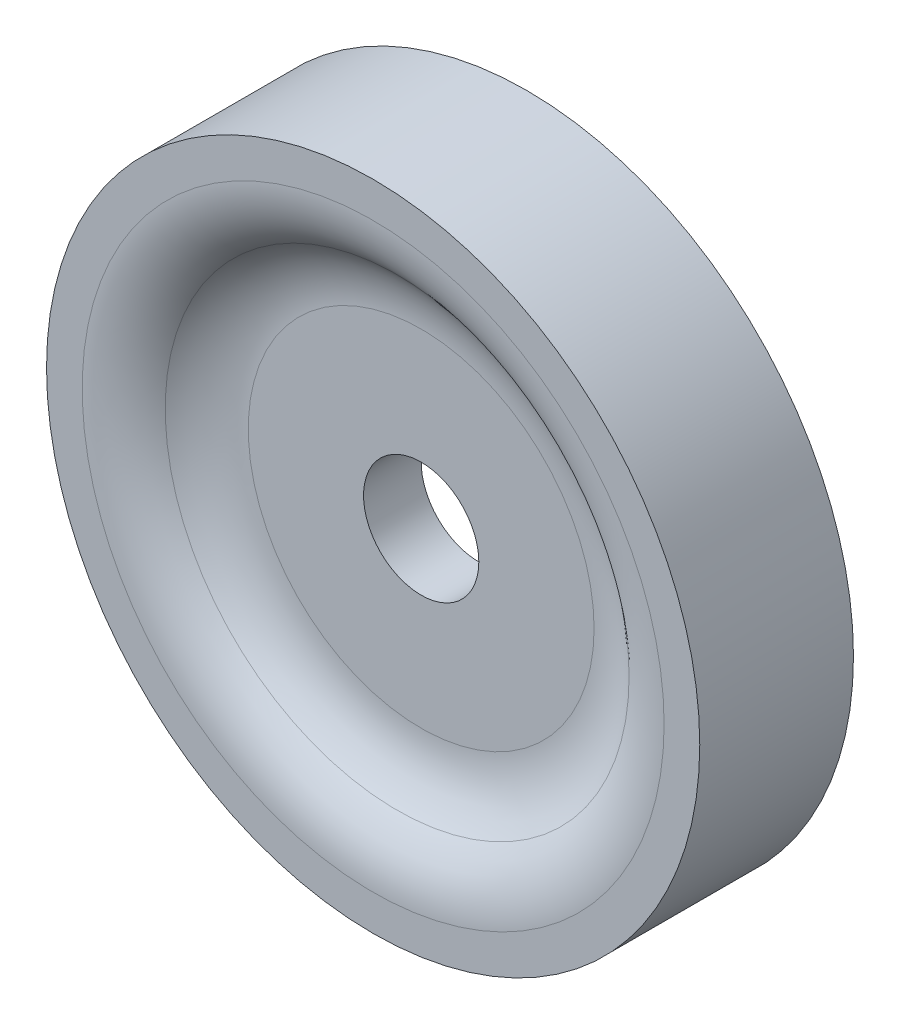
ISO-10303-21;
HEADER;
FILE_DESCRIPTION(('STEP AP214'),'2;1');
FILE_NAME('part.step','',(''),(''),'','','');
FILE_SCHEMA(('AUTOMOTIVE_DESIGN { 1 0 10303 214 1 1 1 1 }'));
ENDSEC;
DATA;
#1=APPLICATION_CONTEXT('core data for automotive mechanical design processes');
#2=APPLICATION_PROTOCOL_DEFINITION('international standard','automotive_design',2000,#1);
#3=PRODUCT_CONTEXT('',#1,'mechanical');
#4=PRODUCT('Part','Part','',(#3));
#5=PRODUCT_RELATED_PRODUCT_CATEGORY('part','',(#4));
#6=PRODUCT_DEFINITION_FORMATION('','',#4);
#7=PRODUCT_DEFINITION_CONTEXT('part definition',#1,'design');
#8=PRODUCT_DEFINITION('design','',#6,#7);
#9=PRODUCT_DEFINITION_SHAPE('','',#8);
#10=(LENGTH_UNIT() NAMED_UNIT(*) SI_UNIT(.MILLI.,.METRE.));
#11=(NAMED_UNIT(*) PLANE_ANGLE_UNIT() SI_UNIT($,.RADIAN.));
#12=(NAMED_UNIT(*) SI_UNIT($,.STERADIAN.) SOLID_ANGLE_UNIT());
#13=UNCERTAINTY_MEASURE_WITH_UNIT(LENGTH_MEASURE(1.E-05),#10,'distance_accuracy_value','');
#14=(GEOMETRIC_REPRESENTATION_CONTEXT(3) GLOBAL_UNCERTAINTY_ASSIGNED_CONTEXT((#13)) GLOBAL_UNIT_ASSIGNED_CONTEXT((#10,
#11,#12)) REPRESENTATION_CONTEXT('',''));
#15=CARTESIAN_POINT('',(0.,0.,0.));
#16=DIRECTION('',(0.,0.,1.));
#17=DIRECTION('',(1.,0.,0.));
#18=AXIS2_PLACEMENT_3D('',#15,#16,#17);
#19=CARTESIAN_POINT('',(15.,0.,-7.5));
#20=DIRECTION('',(0.,0.,-1.));
#21=DIRECTION('',(-1.,0.,0.));
#22=AXIS2_PLACEMENT_3D('',#19,#20,#21);
#23=PLANE('',#22);
#24=CARTESIAN_POINT('',(0.,0.,-7.5));
#25=DIRECTION('',(0.,0.,1.));
#26=DIRECTION('',(1.,0.,0.));
#27=AXIS2_PLACEMENT_3D('',#24,#25,#26);
#28=CIRCLE('',#27,15.);
#29=CARTESIAN_POINT('',(15.,0.,-7.5));
#30=VERTEX_POINT('',#29);
#31=EDGE_CURVE('E10',#30,#30,#28,.T.);
#32=ORIENTED_EDGE('',*,*,#31,.T.);
#33=EDGE_LOOP('',(#32));
#34=FACE_BOUND('',#33,.T.);
#35=CARTESIAN_POINT('',(0.,0.,-7.5));
#36=DIRECTION('',(0.,0.,1.));
#37=DIRECTION('',(1.,0.,0.));
#38=AXIS2_PLACEMENT_3D('',#35,#36,#37);
#39=CIRCLE('',#38,45.);
#40=CARTESIAN_POINT('',(45.,0.,-7.5));
#41=VERTEX_POINT('',#40);
#42=EDGE_CURVE('E84',#41,#41,#39,.T.);
#43=ORIENTED_EDGE('',*,*,#42,.F.);
#44=EDGE_LOOP('',(#43));
#45=FACE_BOUND('',#44,.T.);
#46=ADVANCED_FACE('F41',(#34,#45),#23,.T.);
#47=CARTESIAN_POINT('',(0.,0.,0.));
#48=DIRECTION('',(0.,0.,1.));
#49=DIRECTION('',(1.,0.,0.));
#50=AXIS2_PLACEMENT_3D('',#47,#48,#49);
#51=CYLINDRICAL_SURFACE('',#50,15.);
#52=CARTESIAN_POINT('',(0.,0.,7.5));
#53=DIRECTION('',(0.,0.,1.));
#54=DIRECTION('',(1.,0.,0.));
#55=AXIS2_PLACEMENT_3D('',#52,#53,#54);
#56=CIRCLE('',#55,15.);
#57=CARTESIAN_POINT('',(15.,0.,7.5));
#58=VERTEX_POINT('',#57);
#59=EDGE_CURVE('E48',#58,#58,#56,.T.);
#60=ORIENTED_EDGE('',*,*,#59,.T.);
#61=EDGE_LOOP('',(#60));
#62=FACE_BOUND('',#61,.T.);
#63=ORIENTED_EDGE('',*,*,#31,.F.);
#64=EDGE_LOOP('',(#63));
#65=FACE_BOUND('',#64,.T.);
#66=ADVANCED_FACE('F93',(#62,#65),#51,.F.);
#67=CARTESIAN_POINT('',(15.,0.,7.5));
#68=DIRECTION('',(0.,0.,1.));
#69=DIRECTION('',(1.,0.,0.));
#70=AXIS2_PLACEMENT_3D('',#67,#68,#69);
#71=PLANE('',#70);
#72=CARTESIAN_POINT('',(0.,0.,7.5));
#73=DIRECTION('',(0.,0.,1.));
#74=DIRECTION('',(1.,0.,0.));
#75=AXIS2_PLACEMENT_3D('',#72,#73,#74);
#76=CIRCLE('',#75,45.);
#77=CARTESIAN_POINT('',(45.,0.,7.5));
#78=VERTEX_POINT('',#77);
#79=EDGE_CURVE('E53',#78,#78,#76,.T.);
#80=ORIENTED_EDGE('',*,*,#79,.T.);
#81=EDGE_LOOP('',(#80));
#82=FACE_BOUND('',#81,.T.);
#83=ORIENTED_EDGE('',*,*,#59,.F.);
#84=EDGE_LOOP('',(#83));
#85=FACE_BOUND('',#84,.T.);
#86=ADVANCED_FACE('F97',(#82,#85),#71,.T.);
#87=CARTESIAN_POINT('',(0.,0.,29.5));
#88=DIRECTION('',(0.,0.,1.));
#89=DIRECTION('',(1.,0.,0.));
#90=AXIS2_PLACEMENT_3D('',#87,#88,#89);
#91=TOROIDAL_SURFACE('',#90,45.,22.);
#92=CARTESIAN_POINT('',(0.,0.,13.75));
#93=DIRECTION('',(0.,0.,1.));
#94=DIRECTION('',(1.,0.,0.));
#95=AXIS2_PLACEMENT_3D('',#92,#93,#94);
#96=CIRCLE('',#95,60.3602571593056);
#97=CARTESIAN_POINT('',(60.3602571593056,0.,13.75));
#98=VERTEX_POINT('',#97);
#99=EDGE_CURVE('E58',#98,#98,#96,.T.);
#100=ORIENTED_EDGE('',*,*,#99,.T.);
#101=EDGE_LOOP('',(#100));
#102=FACE_BOUND('',#101,.T.);
#103=ORIENTED_EDGE('',*,*,#79,.F.);
#104=EDGE_LOOP('',(#103));
#105=FACE_BOUND('',#104,.T.);
#106=ADVANCED_FACE('F101',(#102,#105),#91,.F.);
#107=CARTESIAN_POINT('',(0.,0.,-2.));
#108=DIRECTION('',(0.,0.,1.));
#109=DIRECTION('',(1.,0.,0.));
#110=AXIS2_PLACEMENT_3D('',#107,#108,#109);
#111=TOROIDAL_SURFACE('',#110,75.7205143186113,22.);
#112=CARTESIAN_POINT('',(0.,0.,20.));
#113=DIRECTION('',(0.,0.,1.));
#114=DIRECTION('',(1.,0.,0.));
#115=AXIS2_PLACEMENT_3D('',#112,#113,#114);
#116=CIRCLE('',#115,75.7205143186113);
#117=CARTESIAN_POINT('',(75.7205143186113,0.,20.));
#118=VERTEX_POINT('',#117);
#119=EDGE_CURVE('E64',#118,#118,#116,.T.);
#120=ORIENTED_EDGE('',*,*,#119,.T.);
#121=EDGE_LOOP('',(#120));
#122=FACE_BOUND('',#121,.T.);
#123=ORIENTED_EDGE('',*,*,#99,.F.);
#124=EDGE_LOOP('',(#123));
#125=FACE_BOUND('',#124,.T.);
#126=ADVANCED_FACE('F108',(#122,#125),#111,.T.);
#127=CARTESIAN_POINT('',(75.7205143186113,0.,20.));
#128=DIRECTION('',(0.,0.,1.));
#129=DIRECTION('',(1.,0.,0.));
#130=AXIS2_PLACEMENT_3D('',#127,#128,#129);
#131=PLANE('',#130);
#132=CARTESIAN_POINT('',(0.,0.,20.));
#133=DIRECTION('',(0.,0.,1.));
#134=DIRECTION('',(1.,0.,0.));
#135=AXIS2_PLACEMENT_3D('',#132,#133,#134);
#136=CIRCLE('',#135,85.);
#137=CARTESIAN_POINT('',(85.,0.,20.));
#138=VERTEX_POINT('',#137);
#139=EDGE_CURVE('E68',#138,#138,#136,.T.);
#140=ORIENTED_EDGE('',*,*,#139,.T.);
#141=EDGE_LOOP('',(#140));
#142=FACE_BOUND('',#141,.T.);
#143=ORIENTED_EDGE('',*,*,#119,.F.);
#144=EDGE_LOOP('',(#143));
#145=FACE_BOUND('',#144,.T.);
#146=ADVANCED_FACE('F112',(#142,#145),#131,.T.);
#147=CARTESIAN_POINT('',(0.,0.,0.));
#148=DIRECTION('',(0.,0.,1.));
#149=DIRECTION('',(1.,0.,0.));
#150=AXIS2_PLACEMENT_3D('',#147,#148,#149);
#151=CYLINDRICAL_SURFACE('',#150,85.);
#152=CARTESIAN_POINT('',(0.,0.,-20.));
#153=DIRECTION('',(0.,0.,1.));
#154=DIRECTION('',(1.,0.,0.));
#155=AXIS2_PLACEMENT_3D('',#152,#153,#154);
#156=CIRCLE('',#155,85.);
#157=CARTESIAN_POINT('',(85.,0.,-20.));
#158=VERTEX_POINT('',#157);
#159=EDGE_CURVE('E72',#158,#158,#156,.T.);
#160=ORIENTED_EDGE('',*,*,#159,.T.);
#161=EDGE_LOOP('',(#160));
#162=FACE_BOUND('',#161,.T.);
#163=ORIENTED_EDGE('',*,*,#139,.F.);
#164=EDGE_LOOP('',(#163));
#165=FACE_BOUND('',#164,.T.);
#166=ADVANCED_FACE('F116',(#162,#165),#151,.T.);
#167=CARTESIAN_POINT('',(75.7205143186113,0.,-20.));
#168=DIRECTION('',(0.,0.,-1.));
#169=DIRECTION('',(-1.,0.,0.));
#170=AXIS2_PLACEMENT_3D('',#167,#168,#169);
#171=PLANE('',#170);
#172=CARTESIAN_POINT('',(0.,0.,-20.));
#173=DIRECTION('',(0.,0.,1.));
#174=DIRECTION('',(1.,0.,0.));
#175=AXIS2_PLACEMENT_3D('',#172,#173,#174);
#176=CIRCLE('',#175,75.7205143186113);
#177=CARTESIAN_POINT('',(75.7205143186113,0.,-20.));
#178=VERTEX_POINT('',#177);
#179=EDGE_CURVE('E76',#178,#178,#176,.T.);
#180=ORIENTED_EDGE('',*,*,#179,.T.);
#181=EDGE_LOOP('',(#180));
#182=FACE_BOUND('',#181,.T.);
#183=ORIENTED_EDGE('',*,*,#159,.F.);
#184=EDGE_LOOP('',(#183));
#185=FACE_BOUND('',#184,.T.);
#186=ADVANCED_FACE('F120',(#182,#185),#171,.T.);
#187=CARTESIAN_POINT('',(0.,0.,2.));
#188=DIRECTION('',(0.,0.,1.));
#189=DIRECTION('',(1.,0.,0.));
#190=AXIS2_PLACEMENT_3D('',#187,#188,#189);
#191=TOROIDAL_SURFACE('',#190,75.7205143186113,22.);
#192=CARTESIAN_POINT('',(0.,0.,-13.75));
#193=DIRECTION('',(0.,0.,1.));
#194=DIRECTION('',(1.,0.,0.));
#195=AXIS2_PLACEMENT_3D('',#192,#193,#194);
#196=CIRCLE('',#195,60.3602571593056);
#197=CARTESIAN_POINT('',(60.3602571593056,0.,-13.75));
#198=VERTEX_POINT('',#197);
#199=EDGE_CURVE('E80',#198,#198,#196,.T.);
#200=ORIENTED_EDGE('',*,*,#199,.T.);
#201=EDGE_LOOP('',(#200));
#202=FACE_BOUND('',#201,.T.);
#203=ORIENTED_EDGE('',*,*,#179,.F.);
#204=EDGE_LOOP('',(#203));
#205=FACE_BOUND('',#204,.T.);
#206=ADVANCED_FACE('F124',(#202,#205),#191,.T.);
#207=CARTESIAN_POINT('',(0.,0.,-29.5));
#208=DIRECTION('',(0.,0.,1.));
#209=DIRECTION('',(1.,0.,0.));
#210=AXIS2_PLACEMENT_3D('',#207,#208,#209);
#211=TOROIDAL_SURFACE('',#210,45.,22.);
#212=ORIENTED_EDGE('',*,*,#42,.T.);
#213=EDGE_LOOP('',(#212));
#214=FACE_BOUND('',#213,.T.);
#215=ORIENTED_EDGE('',*,*,#199,.F.);
#216=EDGE_LOOP('',(#215));
#217=FACE_BOUND('',#216,.T.);
#218=ADVANCED_FACE('F89',(#214,#217),#211,.F.);
#219=CLOSED_SHELL('',(#46,#66,#86,#106,#126,#146,#166,#186,#206,#218));
#220=MANIFOLD_SOLID_BREP('B2',#219);
#221=ADVANCED_BREP_SHAPE_REPRESENTATION('',(#18,#220),#14);
#222=SHAPE_DEFINITION_REPRESENTATION(#9,#221);
ENDSEC;
END-ISO-10303-21;
